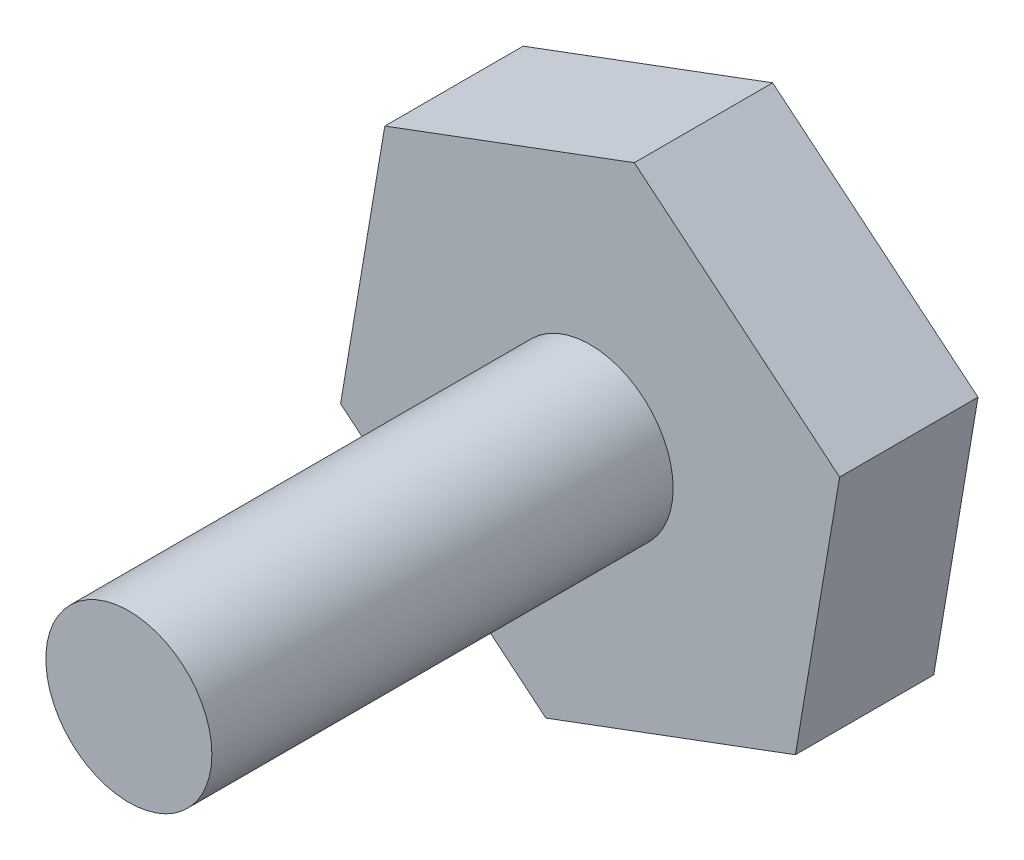
ISO-10303-21;
HEADER;
FILE_DESCRIPTION(('STEP AP214'),'2;1');
FILE_NAME('part.step','',(''),(''),'','','');
FILE_SCHEMA(('AUTOMOTIVE_DESIGN { 1 0 10303 214 1 1 1 1 }'));
ENDSEC;
DATA;
#1=APPLICATION_CONTEXT('core data for automotive mechanical design processes');
#2=APPLICATION_PROTOCOL_DEFINITION('international standard','automotive_design',2000,#1);
#3=PRODUCT_CONTEXT('',#1,'mechanical');
#4=PRODUCT('Part','Part','',(#3));
#5=PRODUCT_RELATED_PRODUCT_CATEGORY('part','',(#4));
#6=PRODUCT_DEFINITION_FORMATION('','',#4);
#7=PRODUCT_DEFINITION_CONTEXT('part definition',#1,'design');
#8=PRODUCT_DEFINITION('design','',#6,#7);
#9=PRODUCT_DEFINITION_SHAPE('','',#8);
#10=(LENGTH_UNIT() NAMED_UNIT(*) SI_UNIT(.MILLI.,.METRE.));
#11=(NAMED_UNIT(*) PLANE_ANGLE_UNIT() SI_UNIT($,.RADIAN.));
#12=(NAMED_UNIT(*) SI_UNIT($,.STERADIAN.) SOLID_ANGLE_UNIT());
#13=UNCERTAINTY_MEASURE_WITH_UNIT(LENGTH_MEASURE(1.E-05),#10,'distance_accuracy_value','');
#14=(GEOMETRIC_REPRESENTATION_CONTEXT(3) GLOBAL_UNCERTAINTY_ASSIGNED_CONTEXT((#13)) GLOBAL_UNIT_ASSIGNED_CONTEXT((#10,
#11,#12)) REPRESENTATION_CONTEXT('',''));
#15=CARTESIAN_POINT('',(0.,0.,0.));
#16=DIRECTION('',(0.,0.,1.));
#17=DIRECTION('',(1.,0.,0.));
#18=AXIS2_PLACEMENT_3D('',#15,#16,#17);
#19=CARTESIAN_POINT('',(-5.31923586860573,-1.80688052767574,3.));
#20=DIRECTION('',(-0.34923173875707,0.937036388111323,0.));
#21=DIRECTION('',(-0.937036388111323,-0.34923173875707,0.));
#22=AXIS2_PLACEMENT_3D('',#19,#20,#21);
#23=PLANE('',#22);
#24=DIRECTION('',(0.937036388111323,0.34923173875707,0.));
#25=VECTOR('',#24,1.);
#26=CARTESIAN_POINT('',(-5.31923586860573,-1.80688052767574,0.));
#27=LINE('',#26,#25);
#28=CARTESIAN_POINT('',(-5.31923586860573,-1.80688052767574,0.));
#29=VERTEX_POINT('',#28);
#30=CARTESIAN_POINT('',(0.0907462405597553,0.209409856133824,0.));
#31=VERTEX_POINT('',#30);
#32=EDGE_CURVE('E119',#29,#31,#27,.T.);
#33=ORIENTED_EDGE('',*,*,#32,.T.);
#34=DIRECTION('',(0.,0.,-1.));
#35=VECTOR('',#34,1.);
#36=CARTESIAN_POINT('',(0.0907462405597553,0.209409856133824,3.));
#37=LINE('',#36,#35);
#38=CARTESIAN_POINT('',(0.0907462405597553,0.209409856133824,3.));
#39=VERTEX_POINT('',#38);
#40=EDGE_CURVE('E36',#39,#31,#37,.T.);
#41=ORIENTED_EDGE('',*,*,#40,.F.);
#42=DIRECTION('',(0.937036388111323,0.34923173875707,0.));
#43=VECTOR('',#42,1.);
#44=CARTESIAN_POINT('',(-5.31923586860573,-1.80688052767574,3.));
#45=LINE('',#44,#43);
#46=CARTESIAN_POINT('',(-5.31923586860573,-1.80688052767574,3.));
#47=VERTEX_POINT('',#46);
#48=EDGE_CURVE('E130',#47,#39,#45,.T.);
#49=ORIENTED_EDGE('',*,*,#48,.F.);
#50=DIRECTION('',(0.,0.,-1.));
#51=VECTOR('',#50,1.);
#52=CARTESIAN_POINT('',(-5.31923586860573,-1.80688052767574,3.));
#53=LINE('',#52,#51);
#54=EDGE_CURVE('E115',#47,#29,#53,.T.);
#55=ORIENTED_EDGE('',*,*,#54,.T.);
#56=EDGE_LOOP('',(#33,#41,#49,#55));
#57=FACE_BOUND('',#56,.T.);
#58=ADVANCED_FACE('F33',(#57),#23,.F.);
#59=CARTESIAN_POINT('',(0.0907462405597553,0.209409856133824,3.));
#60=DIRECTION('',(-0.986113185753355,0.166074636484229,0.));
#61=DIRECTION('',(-0.166074636484229,-0.986113185753355,0.));
#62=AXIS2_PLACEMENT_3D('',#59,#60,#61);
#63=PLANE('',#62);
#64=DIRECTION('',(0.166074636484229,0.986113185753355,0.));
#65=VECTOR('',#64,1.);
#66=CARTESIAN_POINT('',(0.0907462405597553,0.209409856133824,0.));
#67=LINE('',#66,#65);
#68=CARTESIAN_POINT('',(1.04957860135715,5.90273698859526,0.));
#69=VERTEX_POINT('',#68);
#70=EDGE_CURVE('E122',#31,#69,#67,.T.);
#71=ORIENTED_EDGE('',*,*,#70,.T.);
#72=DIRECTION('',(0.,0.,-1.));
#73=VECTOR('',#72,1.);
#74=CARTESIAN_POINT('',(1.04957860135715,5.90273698859526,3.));
#75=LINE('',#74,#73);
#76=CARTESIAN_POINT('',(1.04957860135715,5.90273698859526,3.));
#77=VERTEX_POINT('',#76);
#78=EDGE_CURVE('E133',#77,#69,#75,.T.);
#79=ORIENTED_EDGE('',*,*,#78,.F.);
#80=DIRECTION('',(0.166074636484229,0.986113185753355,0.));
#81=VECTOR('',#80,1.);
#82=CARTESIAN_POINT('',(0.0907462405597553,0.209409856133824,3.));
#83=LINE('',#82,#81);
#84=EDGE_CURVE('E88',#39,#77,#83,.T.);
#85=ORIENTED_EDGE('',*,*,#84,.F.);
#86=ORIENTED_EDGE('',*,*,#40,.T.);
#87=EDGE_LOOP('',(#71,#79,#85,#86));
#88=FACE_BOUND('',#87,.T.);
#89=ADVANCED_FACE('F138',(#88),#63,.F.);
#90=CARTESIAN_POINT('',(1.04957860135715,5.90273698859526,3.));
#91=DIRECTION('',(-0.636881446996284,-0.770961751627095,0.));
#92=DIRECTION('',(0.770961751627095,-0.636881446996285,0.));
#93=AXIS2_PLACEMENT_3D('',#90,#91,#92);
#94=PLANE('',#93);
#95=DIRECTION('',(-0.770961751627095,0.636881446996284,0.));
#96=VECTOR('',#95,1.);
#97=CARTESIAN_POINT('',(1.04957860135715,5.90273698859526,0.));
#98=LINE('',#97,#96);
#99=CARTESIAN_POINT('',(-3.40157114701097,9.57977373724712,0.));
#100=VERTEX_POINT('',#99);
#101=EDGE_CURVE('E125',#69,#100,#98,.T.);
#102=ORIENTED_EDGE('',*,*,#101,.T.);
#103=DIRECTION('',(0.,0.,-1.));
#104=VECTOR('',#103,1.);
#105=CARTESIAN_POINT('',(-3.40157114701097,9.57977373724712,3.));
#106=LINE('',#105,#104);
#107=CARTESIAN_POINT('',(-3.40157114701097,9.57977373724712,3.));
#108=VERTEX_POINT('',#107);
#109=EDGE_CURVE('E110',#108,#100,#106,.T.);
#110=ORIENTED_EDGE('',*,*,#109,.F.);
#111=DIRECTION('',(-0.770961751627095,0.636881446996284,0.));
#112=VECTOR('',#111,1.);
#113=CARTESIAN_POINT('',(1.04957860135715,5.90273698859526,3.));
#114=LINE('',#113,#112);
#115=EDGE_CURVE('E101',#77,#108,#114,.T.);
#116=ORIENTED_EDGE('',*,*,#115,.F.);
#117=ORIENTED_EDGE('',*,*,#78,.T.);
#118=EDGE_LOOP('',(#102,#110,#116,#117));
#119=FACE_BOUND('',#118,.T.);
#120=ADVANCED_FACE('F144',(#119),#94,.F.);
#121=CARTESIAN_POINT('',(-3.40157114701097,9.57977373724712,3.));
#122=DIRECTION('',(0.34923173875707,-0.937036388111323,0.));
#123=DIRECTION('',(0.937036388111323,0.34923173875707,0.));
#124=AXIS2_PLACEMENT_3D('',#121,#122,#123);
#125=PLANE('',#124);
#126=DIRECTION('',(-0.937036388111323,-0.34923173875707,0.));
#127=VECTOR('',#126,1.);
#128=CARTESIAN_POINT('',(-3.40157114701097,9.57977373724712,0.));
#129=LINE('',#128,#127);
#130=CARTESIAN_POINT('',(-8.81155325617646,7.56348335343756,0.));
#131=VERTEX_POINT('',#130);
#132=EDGE_CURVE('E109',#100,#131,#129,.T.);
#133=ORIENTED_EDGE('',*,*,#132,.T.);
#134=DIRECTION('',(0.,0.,-1.));
#135=VECTOR('',#134,1.);
#136=CARTESIAN_POINT('',(-8.81155325617646,7.56348335343756,3.));
#137=LINE('',#136,#135);
#138=CARTESIAN_POINT('',(-8.81155325617646,7.56348335343756,3.));
#139=VERTEX_POINT('',#138);
#140=EDGE_CURVE('E106',#139,#131,#137,.T.);
#141=ORIENTED_EDGE('',*,*,#140,.F.);
#142=DIRECTION('',(-0.937036388111323,-0.34923173875707,0.));
#143=VECTOR('',#142,1.);
#144=CARTESIAN_POINT('',(-3.40157114701097,9.57977373724712,3.));
#145=LINE('',#144,#143);
#146=EDGE_CURVE('E95',#108,#139,#145,.T.);
#147=ORIENTED_EDGE('',*,*,#146,.F.);
#148=ORIENTED_EDGE('',*,*,#109,.T.);
#149=EDGE_LOOP('',(#133,#141,#147,#148));
#150=FACE_BOUND('',#149,.T.);
#151=ADVANCED_FACE('F107',(#150),#125,.F.);
#152=CARTESIAN_POINT('',(-8.81155325617646,7.56348335343756,3.));
#153=DIRECTION('',(0.986113185753355,-0.166074636484228,0.));
#154=DIRECTION('',(0.166074636484228,0.986113185753355,0.));
#155=AXIS2_PLACEMENT_3D('',#152,#153,#154);
#156=PLANE('',#155);
#157=DIRECTION('',(-0.166074636484228,-0.986113185753355,0.));
#158=VECTOR('',#157,1.);
#159=CARTESIAN_POINT('',(-8.81155325617646,7.56348335343756,0.));
#160=LINE('',#159,#158);
#161=CARTESIAN_POINT('',(-9.77038561697385,1.87015622097613,0.));
#162=VERTEX_POINT('',#161);
#163=EDGE_CURVE('E73',#131,#162,#160,.T.);
#164=ORIENTED_EDGE('',*,*,#163,.T.);
#165=DIRECTION('',(0.,0.,-1.));
#166=VECTOR('',#165,1.);
#167=CARTESIAN_POINT('',(-9.77038561697385,1.87015622097613,3.));
#168=LINE('',#167,#166);
#169=CARTESIAN_POINT('',(-9.77038561697385,1.87015622097613,3.));
#170=VERTEX_POINT('',#169);
#171=EDGE_CURVE('E111',#170,#162,#168,.T.);
#172=ORIENTED_EDGE('',*,*,#171,.F.);
#173=DIRECTION('',(-0.166074636484228,-0.986113185753355,0.));
#174=VECTOR('',#173,1.);
#175=CARTESIAN_POINT('',(-8.81155325617646,7.56348335343756,3.));
#176=LINE('',#175,#174);
#177=EDGE_CURVE('E99',#139,#170,#176,.T.);
#178=ORIENTED_EDGE('',*,*,#177,.F.);
#179=ORIENTED_EDGE('',*,*,#140,.T.);
#180=EDGE_LOOP('',(#164,#172,#178,#179));
#181=FACE_BOUND('',#180,.T.);
#182=ADVANCED_FACE('F113',(#181),#156,.F.);
#183=CARTESIAN_POINT('',(-9.77038561697385,1.87015622097613,3.));
#184=DIRECTION('',(0.636881446996285,0.770961751627095,0.));
#185=DIRECTION('',(-0.770961751627095,0.636881446996285,0.));
#186=AXIS2_PLACEMENT_3D('',#183,#184,#185);
#187=PLANE('',#186);
#188=DIRECTION('',(0.770961751627094,-0.636881446996285,0.));
#189=VECTOR('',#188,1.);
#190=CARTESIAN_POINT('',(-9.77038561697385,1.87015622097613,0.));
#191=LINE('',#190,#189);
#192=EDGE_CURVE('E79',#162,#29,#191,.T.);
#193=ORIENTED_EDGE('',*,*,#192,.T.);
#194=ORIENTED_EDGE('',*,*,#54,.F.);
#195=DIRECTION('',(0.770961751627094,-0.636881446996285,0.));
#196=VECTOR('',#195,1.);
#197=CARTESIAN_POINT('',(-9.77038561697385,1.87015622097613,3.));
#198=LINE('',#197,#196);
#199=EDGE_CURVE('E50',#170,#47,#198,.T.);
#200=ORIENTED_EDGE('',*,*,#199,.F.);
#201=ORIENTED_EDGE('',*,*,#171,.T.);
#202=EDGE_LOOP('',(#193,#194,#200,#201));
#203=FACE_BOUND('',#202,.T.);
#204=ADVANCED_FACE('F160',(#203),#187,.F.);
#205=CARTESIAN_POINT('',(0.,0.,3.));
#206=DIRECTION('',(0.,0.,1.));
#207=DIRECTION('',(1.,0.,0.));
#208=AXIS2_PLACEMENT_3D('',#205,#206,#207);
#209=PLANE('',#208);
#210=CARTESIAN_POINT('',(-4.36040350780838,3.88644660478572,3.));
#211=DIRECTION('',(0.,0.,1.));
#212=DIRECTION('',(1.,0.,0.));
#213=AXIS2_PLACEMENT_3D('',#210,#211,#212);
#214=CIRCLE('',#213,1.8);
#215=CARTESIAN_POINT('',(-2.56040350780838,3.88644660478572,3.));
#216=VERTEX_POINT('',#215);
#217=EDGE_CURVE('E11',#216,#216,#214,.T.);
#218=ORIENTED_EDGE('',*,*,#217,.F.);
#219=EDGE_LOOP('',(#218));
#220=FACE_BOUND('',#219,.T.);
#221=ORIENTED_EDGE('',*,*,#48,.T.);
#222=ORIENTED_EDGE('',*,*,#84,.T.);
#223=ORIENTED_EDGE('',*,*,#115,.T.);
#224=ORIENTED_EDGE('',*,*,#146,.T.);
#225=ORIENTED_EDGE('',*,*,#177,.T.);
#226=ORIENTED_EDGE('',*,*,#199,.T.);
#227=EDGE_LOOP('',(#221,#222,#223,#224,#225,#226));
#228=FACE_BOUND('',#227,.T.);
#229=ADVANCED_FACE('F97',(#220,#228),#209,.T.);
#230=CARTESIAN_POINT('',(0.,0.,0.));
#231=DIRECTION('',(0.,0.,1.));
#232=DIRECTION('',(1.,0.,0.));
#233=AXIS2_PLACEMENT_3D('',#230,#231,#232);
#234=PLANE('',#233);
#235=ORIENTED_EDGE('',*,*,#32,.F.);
#236=ORIENTED_EDGE('',*,*,#192,.F.);
#237=ORIENTED_EDGE('',*,*,#163,.F.);
#238=ORIENTED_EDGE('',*,*,#132,.F.);
#239=ORIENTED_EDGE('',*,*,#101,.F.);
#240=ORIENTED_EDGE('',*,*,#70,.F.);
#241=EDGE_LOOP('',(#235,#236,#237,#238,#239,#240));
#242=FACE_BOUND('',#241,.T.);
#243=ADVANCED_FACE('F143',(#242),#234,.F.);
#244=CARTESIAN_POINT('',(-4.36040350780838,3.88644660478572,13.));
#245=DIRECTION('',(0.,0.,-1.));
#246=DIRECTION('',(-1.,0.,0.));
#247=AXIS2_PLACEMENT_3D('',#244,#245,#246);
#248=CYLINDRICAL_SURFACE('',#247,1.8);
#249=CARTESIAN_POINT('',(-4.36040350780838,3.88644660478572,13.));
#250=DIRECTION('',(0.,0.,1.));
#251=DIRECTION('',(1.,0.,0.));
#252=AXIS2_PLACEMENT_3D('',#249,#250,#251);
#253=CIRCLE('',#252,1.8);
#254=CARTESIAN_POINT('',(-2.56040350780838,3.88644660478572,13.));
#255=VERTEX_POINT('',#254);
#256=EDGE_CURVE('E123',#255,#255,#253,.T.);
#257=ORIENTED_EDGE('',*,*,#256,.F.);
#258=EDGE_LOOP('',(#257));
#259=FACE_BOUND('',#258,.T.);
#260=ORIENTED_EDGE('',*,*,#217,.T.);
#261=EDGE_LOOP('',(#260));
#262=FACE_BOUND('',#261,.T.);
#263=ADVANCED_FACE('F153',(#259,#262),#248,.T.);
#264=CARTESIAN_POINT('',(-4.36040350780838,3.88644660478572,13.));
#265=DIRECTION('',(0.,0.,1.));
#266=DIRECTION('',(1.,0.,0.));
#267=AXIS2_PLACEMENT_3D('',#264,#265,#266);
#268=PLANE('',#267);
#269=ORIENTED_EDGE('',*,*,#256,.T.);
#270=EDGE_LOOP('',(#269));
#271=FACE_BOUND('',#270,.T.);
#272=ADVANCED_FACE('F151',(#271),#268,.T.);
#273=CLOSED_SHELL('',(#58,#89,#120,#151,#182,#204,#229,#243,#263,#272));
#274=MANIFOLD_SOLID_BREP('B2',#273);
#275=ADVANCED_BREP_SHAPE_REPRESENTATION('',(#18,#274),#14);
#276=SHAPE_DEFINITION_REPRESENTATION(#9,#275);
ENDSEC;
END-ISO-10303-21;
